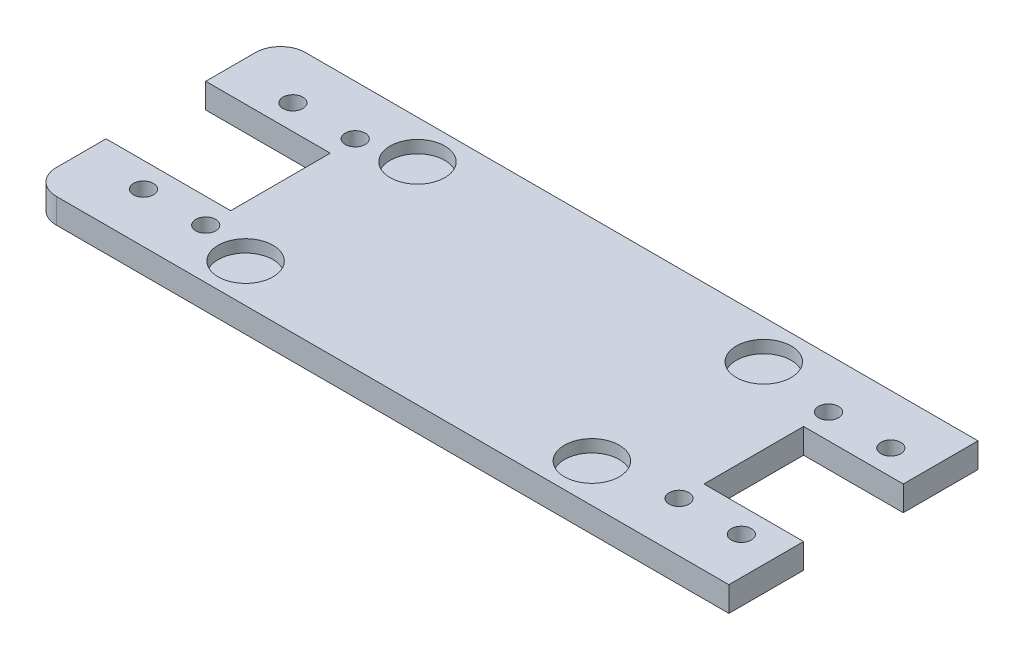
ISO-10303-21;
HEADER;
FILE_DESCRIPTION(('STEP AP214'),'2;1');
FILE_NAME('part.step','',(''),(''),'','','');
FILE_SCHEMA(('AUTOMOTIVE_DESIGN { 1 0 10303 214 1 1 1 1 }'));
ENDSEC;
DATA;
#1=APPLICATION_CONTEXT('core data for automotive mechanical design processes');
#2=APPLICATION_PROTOCOL_DEFINITION('international standard','automotive_design',2000,#1);
#3=PRODUCT_CONTEXT('',#1,'mechanical');
#4=PRODUCT('Part','Part','',(#3));
#5=PRODUCT_RELATED_PRODUCT_CATEGORY('part','',(#4));
#6=PRODUCT_DEFINITION_FORMATION('','',#4);
#7=PRODUCT_DEFINITION_CONTEXT('part definition',#1,'design');
#8=PRODUCT_DEFINITION('design','',#6,#7);
#9=PRODUCT_DEFINITION_SHAPE('','',#8);
#10=(LENGTH_UNIT() NAMED_UNIT(*) SI_UNIT(.MILLI.,.METRE.));
#11=(NAMED_UNIT(*) PLANE_ANGLE_UNIT() SI_UNIT($,.RADIAN.));
#12=(NAMED_UNIT(*) SI_UNIT($,.STERADIAN.) SOLID_ANGLE_UNIT());
#13=UNCERTAINTY_MEASURE_WITH_UNIT(LENGTH_MEASURE(1.E-05),#10,'distance_accuracy_value','');
#14=(GEOMETRIC_REPRESENTATION_CONTEXT(3) GLOBAL_UNCERTAINTY_ASSIGNED_CONTEXT((#13)) GLOBAL_UNIT_ASSIGNED_CONTEXT((#10,
#11,#12)) REPRESENTATION_CONTEXT('',''));
#15=CARTESIAN_POINT('',(0.,0.,0.));
#16=DIRECTION('',(0.,0.,1.));
#17=DIRECTION('',(1.,0.,0.));
#18=AXIS2_PLACEMENT_3D('',#15,#16,#17);
#19=CARTESIAN_POINT('',(0.,10.,0.));
#20=DIRECTION('',(0.,1.,0.));
#21=DIRECTION('',(0.,0.,1.));
#22=AXIS2_PLACEMENT_3D('',#19,#20,#21);
#23=PLANE('',#22);
#24=CARTESIAN_POINT('',(69.5,10.,-34.5));
#25=DIRECTION('',(0.,1.,0.));
#26=DIRECTION('',(0.,0.,1.));
#27=AXIS2_PLACEMENT_3D('',#24,#25,#26);
#28=CIRCLE('',#27,11.);
#29=CARTESIAN_POINT('',(69.5,10.,-23.5));
#30=VERTEX_POINT('',#29);
#31=EDGE_CURVE('E499',#30,#30,#28,.F.);
#32=ORIENTED_EDGE('',*,*,#31,.T.);
#33=EDGE_LOOP('',(#32));
#34=FACE_BOUND('',#33,.T.);
#35=CARTESIAN_POINT('',(-69.5,10.,34.5));
#36=DIRECTION('',(0.,1.,0.));
#37=DIRECTION('',(0.,0.,1.));
#38=AXIS2_PLACEMENT_3D('',#35,#36,#37);
#39=CIRCLE('',#38,11.);
#40=CARTESIAN_POINT('',(-69.5,10.,45.5));
#41=VERTEX_POINT('',#40);
#42=EDGE_CURVE('E475',#41,#41,#39,.F.);
#43=ORIENTED_EDGE('',*,*,#42,.T.);
#44=EDGE_LOOP('',(#43));
#45=FACE_BOUND('',#44,.T.);
#46=DIRECTION('',(1.,0.,0.));
#47=VECTOR('',#46,1.);
#48=CARTESIAN_POINT('',(100.,10.,20.));
#49=LINE('',#48,#47);
#50=CARTESIAN_POINT('',(100.,10.,20.));
#51=VERTEX_POINT('',#50);
#52=CARTESIAN_POINT('',(140.,10.,20.));
#53=VERTEX_POINT('',#52);
#54=EDGE_CURVE('E154',#51,#53,#49,.T.);
#55=ORIENTED_EDGE('',*,*,#54,.F.);
#56=DIRECTION('',(0.,0.,1.));
#57=VECTOR('',#56,1.);
#58=CARTESIAN_POINT('',(100.,10.,-20.));
#59=LINE('',#58,#57);
#60=CARTESIAN_POINT('',(100.,10.,-20.));
#61=VERTEX_POINT('',#60);
#62=EDGE_CURVE('E458',#61,#51,#59,.T.);
#63=ORIENTED_EDGE('',*,*,#62,.F.);
#64=DIRECTION('',(-1.,0.,0.));
#65=VECTOR('',#64,1.);
#66=CARTESIAN_POINT('',(140.,10.,-20.));
#67=LINE('',#66,#65);
#68=CARTESIAN_POINT('',(140.,10.,-20.));
#69=VERTEX_POINT('',#68);
#70=EDGE_CURVE('E464',#69,#61,#67,.T.);
#71=ORIENTED_EDGE('',*,*,#70,.F.);
#72=DIRECTION('',(0.,0.,-1.));
#73=VECTOR('',#72,1.);
#74=CARTESIAN_POINT('',(140.,10.,-50.));
#75=LINE('',#74,#73);
#76=CARTESIAN_POINT('',(140.,10.,-50.));
#77=VERTEX_POINT('',#76);
#78=EDGE_CURVE('E162',#69,#77,#75,.T.);
#79=ORIENTED_EDGE('',*,*,#78,.T.);
#80=DIRECTION('',(-1.,0.,0.));
#81=VECTOR('',#80,1.);
#82=CARTESIAN_POINT('',(-140.,10.,-50.));
#83=LINE('',#82,#81);
#84=CARTESIAN_POINT('',(-130.,10.,-50.));
#85=VERTEX_POINT('',#84);
#86=EDGE_CURVE('E254',#77,#85,#83,.T.);
#87=ORIENTED_EDGE('',*,*,#86,.T.);
#88=CARTESIAN_POINT('',(-130.,10.,-40.));
#89=DIRECTION('',(0.,1.,0.));
#90=DIRECTION('',(0.,0.,1.));
#91=AXIS2_PLACEMENT_3D('',#88,#89,#90);
#92=CIRCLE('',#91,10.);
#93=CARTESIAN_POINT('',(-140.,10.,-40.));
#94=VERTEX_POINT('',#93);
#95=EDGE_CURVE('E11',#85,#94,#92,.T.);
#96=ORIENTED_EDGE('',*,*,#95,.T.);
#97=DIRECTION('',(0.,0.,1.));
#98=VECTOR('',#97,1.);
#99=CARTESIAN_POINT('',(-140.,10.,-50.));
#100=LINE('',#99,#98);
#101=CARTESIAN_POINT('',(-140.,10.,-20.));
#102=VERTEX_POINT('',#101);
#103=EDGE_CURVE('E245',#94,#102,#100,.T.);
#104=ORIENTED_EDGE('',*,*,#103,.T.);
#105=DIRECTION('',(-1.,0.,0.));
#106=VECTOR('',#105,1.);
#107=CARTESIAN_POINT('',(-140.,10.,-20.));
#108=LINE('',#107,#106);
#109=CARTESIAN_POINT('',(-90.,10.,-20.));
#110=VERTEX_POINT('',#109);
#111=EDGE_CURVE('E408',#110,#102,#108,.T.);
#112=ORIENTED_EDGE('',*,*,#111,.F.);
#113=DIRECTION('',(0.,0.,-1.));
#114=VECTOR('',#113,1.);
#115=CARTESIAN_POINT('',(-90.,10.,-20.));
#116=LINE('',#115,#114);
#117=CARTESIAN_POINT('',(-90.,10.,20.));
#118=VERTEX_POINT('',#117);
#119=EDGE_CURVE('E414',#118,#110,#116,.T.);
#120=ORIENTED_EDGE('',*,*,#119,.F.);
#121=DIRECTION('',(1.,0.,0.));
#122=VECTOR('',#121,1.);
#123=CARTESIAN_POINT('',(-90.,10.,20.));
#124=LINE('',#123,#122);
#125=CARTESIAN_POINT('',(-140.,10.,20.));
#126=VERTEX_POINT('',#125);
#127=EDGE_CURVE('E420',#126,#118,#124,.T.);
#128=ORIENTED_EDGE('',*,*,#127,.F.);
#129=CARTESIAN_POINT('',(-140.,10.,40.));
#130=VERTEX_POINT('',#129);
#131=EDGE_CURVE('E249',#126,#130,#100,.T.);
#132=ORIENTED_EDGE('',*,*,#131,.T.);
#133=CARTESIAN_POINT('',(-130.,10.,40.));
#134=DIRECTION('',(0.,1.,0.));
#135=DIRECTION('',(0.,0.,1.));
#136=AXIS2_PLACEMENT_3D('',#133,#134,#135);
#137=CIRCLE('',#136,10.);
#138=CARTESIAN_POINT('',(-130.,10.,50.));
#139=VERTEX_POINT('',#138);
#140=EDGE_CURVE('E211',#130,#139,#137,.T.);
#141=ORIENTED_EDGE('',*,*,#140,.T.);
#142=DIRECTION('',(1.,0.,0.));
#143=VECTOR('',#142,1.);
#144=CARTESIAN_POINT('',(-140.,10.,50.));
#145=LINE('',#144,#143);
#146=CARTESIAN_POINT('',(140.,10.,50.));
#147=VERTEX_POINT('',#146);
#148=EDGE_CURVE('E183',#139,#147,#145,.T.);
#149=ORIENTED_EDGE('',*,*,#148,.T.);
#150=EDGE_CURVE('E258',#147,#53,#75,.T.);
#151=ORIENTED_EDGE('',*,*,#150,.T.);
#152=EDGE_LOOP('',(#55,#63,#71,#79,#87,#96,#104,#112,#120,#128,#132,#141,#149,#151));
#153=FACE_BOUND('',#152,.T.);
#154=CARTESIAN_POINT('',(125.,10.,30.));
#155=DIRECTION('',(0.,-1.,0.));
#156=DIRECTION('',(0.,0.,-1.));
#157=AXIS2_PLACEMENT_3D('',#154,#155,#156);
#158=CIRCLE('',#157,3.99999999999999);
#159=CARTESIAN_POINT('',(125.,10.,26.));
#160=VERTEX_POINT('',#159);
#161=EDGE_CURVE('E351',#160,#160,#158,.T.);
#162=ORIENTED_EDGE('',*,*,#161,.T.);
#163=EDGE_LOOP('',(#162));
#164=FACE_BOUND('',#163,.T.);
#165=CARTESIAN_POINT('',(100.,10.,30.));
#166=DIRECTION('',(0.,-1.,0.));
#167=DIRECTION('',(0.,0.,-1.));
#168=AXIS2_PLACEMENT_3D('',#165,#166,#167);
#169=CIRCLE('',#168,4.00000000000001);
#170=CARTESIAN_POINT('',(100.,10.,26.));
#171=VERTEX_POINT('',#170);
#172=EDGE_CURVE('E363',#171,#171,#169,.T.);
#173=ORIENTED_EDGE('',*,*,#172,.T.);
#174=EDGE_LOOP('',(#173));
#175=FACE_BOUND('',#174,.T.);
#176=CARTESIAN_POINT('',(125.,10.,-30.));
#177=DIRECTION('',(0.,1.,0.));
#178=DIRECTION('',(0.,0.,1.));
#179=AXIS2_PLACEMENT_3D('',#176,#177,#178);
#180=CIRCLE('',#179,3.99999999999999);
#181=CARTESIAN_POINT('',(125.,10.,-26.));
#182=VERTEX_POINT('',#181);
#183=EDGE_CURVE('E327',#182,#182,#180,.T.);
#184=ORIENTED_EDGE('',*,*,#183,.F.);
#185=EDGE_LOOP('',(#184));
#186=FACE_BOUND('',#185,.T.);
#187=CARTESIAN_POINT('',(100.,10.,-30.));
#188=DIRECTION('',(0.,1.,0.));
#189=DIRECTION('',(0.,0.,1.));
#190=AXIS2_PLACEMENT_3D('',#187,#188,#189);
#191=CIRCLE('',#190,4.00000000000001);
#192=CARTESIAN_POINT('',(100.,10.,-26.));
#193=VERTEX_POINT('',#192);
#194=EDGE_CURVE('E339',#193,#193,#191,.T.);
#195=ORIENTED_EDGE('',*,*,#194,.F.);
#196=EDGE_LOOP('',(#195));
#197=FACE_BOUND('',#196,.T.);
#198=CARTESIAN_POINT('',(-115.,10.,-30.));
#199=DIRECTION('',(0.,-1.,0.));
#200=DIRECTION('',(0.,0.,-1.));
#201=AXIS2_PLACEMENT_3D('',#198,#199,#200);
#202=CIRCLE('',#201,4.00000000000001);
#203=CARTESIAN_POINT('',(-115.,10.,-34.));
#204=VERTEX_POINT('',#203);
#205=EDGE_CURVE('E303',#204,#204,#202,.T.);
#206=ORIENTED_EDGE('',*,*,#205,.T.);
#207=EDGE_LOOP('',(#206));
#208=FACE_BOUND('',#207,.T.);
#209=CARTESIAN_POINT('',(-90.,10.,-30.));
#210=DIRECTION('',(0.,-1.,0.));
#211=DIRECTION('',(0.,0.,-1.));
#212=AXIS2_PLACEMENT_3D('',#209,#210,#211);
#213=CIRCLE('',#212,4.00000000000001);
#214=CARTESIAN_POINT('',(-90.,10.,-34.));
#215=VERTEX_POINT('',#214);
#216=EDGE_CURVE('E315',#215,#215,#213,.T.);
#217=ORIENTED_EDGE('',*,*,#216,.T.);
#218=EDGE_LOOP('',(#217));
#219=FACE_BOUND('',#218,.T.);
#220=CARTESIAN_POINT('',(-115.,10.,30.));
#221=DIRECTION('',(0.,1.,0.));
#222=DIRECTION('',(0.,0.,1.));
#223=AXIS2_PLACEMENT_3D('',#220,#221,#222);
#224=CIRCLE('',#223,4.00000000000001);
#225=CARTESIAN_POINT('',(-115.,10.,34.));
#226=VERTEX_POINT('',#225);
#227=EDGE_CURVE('E179',#226,#226,#224,.T.);
#228=ORIENTED_EDGE('',*,*,#227,.F.);
#229=EDGE_LOOP('',(#228));
#230=FACE_BOUND('',#229,.T.);
#231=CARTESIAN_POINT('',(-90.,10.,30.));
#232=DIRECTION('',(0.,1.,0.));
#233=DIRECTION('',(0.,0.,1.));
#234=AXIS2_PLACEMENT_3D('',#231,#232,#233);
#235=CIRCLE('',#234,4.00000000000001);
#236=CARTESIAN_POINT('',(-90.,10.,34.));
#237=VERTEX_POINT('',#236);
#238=EDGE_CURVE('E291',#237,#237,#235,.T.);
#239=ORIENTED_EDGE('',*,*,#238,.F.);
#240=EDGE_LOOP('',(#239));
#241=FACE_BOUND('',#240,.T.);
#242=CARTESIAN_POINT('',(-69.5,10.,-34.5));
#243=DIRECTION('',(0.,1.,0.));
#244=DIRECTION('',(0.,0.,1.));
#245=AXIS2_PLACEMENT_3D('',#242,#243,#244);
#246=CIRCLE('',#245,11.);
#247=CARTESIAN_POINT('',(-69.5,10.,-23.5));
#248=VERTEX_POINT('',#247);
#249=EDGE_CURVE('E487',#248,#248,#246,.T.);
#250=ORIENTED_EDGE('',*,*,#249,.F.);
#251=EDGE_LOOP('',(#250));
#252=FACE_BOUND('',#251,.T.);
#253=CARTESIAN_POINT('',(69.5,10.,34.5));
#254=DIRECTION('',(0.,1.,0.));
#255=DIRECTION('',(0.,0.,1.));
#256=AXIS2_PLACEMENT_3D('',#253,#254,#255);
#257=CIRCLE('',#256,11.);
#258=CARTESIAN_POINT('',(69.5,10.,45.5));
#259=VERTEX_POINT('',#258);
#260=EDGE_CURVE('E511',#259,#259,#257,.T.);
#261=ORIENTED_EDGE('',*,*,#260,.F.);
#262=EDGE_LOOP('',(#261));
#263=FACE_BOUND('',#262,.T.);
#264=ADVANCED_FACE('F43',(#34,#45,#153,#164,#175,#186,#197,#208,#219,#230,#241,#252,#263),#23,.T.);
#265=CARTESIAN_POINT('',(140.,10.,-50.));
#266=DIRECTION('',(-1.,0.,0.));
#267=DIRECTION('',(0.,0.,1.));
#268=AXIS2_PLACEMENT_3D('',#265,#266,#267);
#269=PLANE('',#268);
#270=DIRECTION('',(0.,0.,-1.));
#271=VECTOR('',#270,1.);
#272=CARTESIAN_POINT('',(140.,0.,-50.));
#273=LINE('',#272,#271);
#274=CARTESIAN_POINT('',(140.,0.,50.));
#275=VERTEX_POINT('',#274);
#276=CARTESIAN_POINT('',(140.,0.,20.));
#277=VERTEX_POINT('',#276);
#278=EDGE_CURVE('E170',#275,#277,#273,.T.);
#279=ORIENTED_EDGE('',*,*,#278,.T.);
#280=DIRECTION('',(0.,1.,0.));
#281=VECTOR('',#280,1.);
#282=CARTESIAN_POINT('',(140.,0.,20.));
#283=LINE('',#282,#281);
#284=EDGE_CURVE('E426',#277,#53,#283,.T.);
#285=ORIENTED_EDGE('',*,*,#284,.T.);
#286=ORIENTED_EDGE('',*,*,#150,.F.);
#287=DIRECTION('',(0.,-1.,0.));
#288=VECTOR('',#287,1.);
#289=CARTESIAN_POINT('',(140.,10.,50.));
#290=LINE('',#289,#288);
#291=EDGE_CURVE('E194',#147,#275,#290,.T.);
#292=ORIENTED_EDGE('',*,*,#291,.T.);
#293=EDGE_LOOP('',(#279,#285,#286,#292));
#294=FACE_BOUND('',#293,.T.);
#295=ADVANCED_FACE('F523',(#294),#269,.F.);
#296=CARTESIAN_POINT('',(-140.,10.,-50.));
#297=DIRECTION('',(1.,0.,0.));
#298=DIRECTION('',(0.,0.,-1.));
#299=AXIS2_PLACEMENT_3D('',#296,#297,#298);
#300=PLANE('',#299);
#301=ORIENTED_EDGE('',*,*,#103,.F.);
#302=DIRECTION('',(0.,-1.,0.));
#303=VECTOR('',#302,1.);
#304=CARTESIAN_POINT('',(-140.,10.,-40.));
#305=LINE('',#304,#303);
#306=CARTESIAN_POINT('',(-140.,0.,-40.));
#307=VERTEX_POINT('',#306);
#308=EDGE_CURVE('E214',#94,#307,#305,.T.);
#309=ORIENTED_EDGE('',*,*,#308,.T.);
#310=DIRECTION('',(0.,0.,1.));
#311=VECTOR('',#310,1.);
#312=CARTESIAN_POINT('',(-140.,0.,-50.));
#313=LINE('',#312,#311);
#314=CARTESIAN_POINT('',(-140.,0.,-20.));
#315=VERTEX_POINT('',#314);
#316=EDGE_CURVE('E188',#307,#315,#313,.T.);
#317=ORIENTED_EDGE('',*,*,#316,.T.);
#318=DIRECTION('',(0.,1.,0.));
#319=VECTOR('',#318,1.);
#320=CARTESIAN_POINT('',(-140.,0.,-20.));
#321=LINE('',#320,#319);
#322=EDGE_CURVE('E369',#315,#102,#321,.T.);
#323=ORIENTED_EDGE('',*,*,#322,.T.);
#324=EDGE_LOOP('',(#301,#309,#317,#323));
#325=FACE_BOUND('',#324,.T.);
#326=ADVANCED_FACE('F529',(#325),#300,.F.);
#327=ORIENTED_EDGE('',*,*,#78,.F.);
#328=DIRECTION('',(0.,1.,0.));
#329=VECTOR('',#328,1.);
#330=CARTESIAN_POINT('',(140.,0.,-20.));
#331=LINE('',#330,#329);
#332=CARTESIAN_POINT('',(140.,0.,-20.));
#333=VERTEX_POINT('',#332);
#334=EDGE_CURVE('E148',#333,#69,#331,.T.);
#335=ORIENTED_EDGE('',*,*,#334,.F.);
#336=CARTESIAN_POINT('',(140.,0.,-50.));
#337=VERTEX_POINT('',#336);
#338=EDGE_CURVE('E160',#333,#337,#273,.T.);
#339=ORIENTED_EDGE('',*,*,#338,.T.);
#340=DIRECTION('',(0.,-1.,0.));
#341=VECTOR('',#340,1.);
#342=CARTESIAN_POINT('',(140.,10.,-50.));
#343=LINE('',#342,#341);
#344=EDGE_CURVE('E198',#77,#337,#343,.T.);
#345=ORIENTED_EDGE('',*,*,#344,.F.);
#346=EDGE_LOOP('',(#327,#335,#339,#345));
#347=FACE_BOUND('',#346,.T.);
#348=ADVANCED_FACE('F158',(#347),#269,.F.);
#349=CARTESIAN_POINT('',(-140.,10.,-50.));
#350=DIRECTION('',(0.,0.,1.));
#351=DIRECTION('',(1.,0.,0.));
#352=AXIS2_PLACEMENT_3D('',#349,#350,#351);
#353=PLANE('',#352);
#354=DIRECTION('',(-1.,0.,0.));
#355=VECTOR('',#354,1.);
#356=CARTESIAN_POINT('',(-140.,0.,-50.));
#357=LINE('',#356,#355);
#358=CARTESIAN_POINT('',(-130.,0.,-50.));
#359=VERTEX_POINT('',#358);
#360=EDGE_CURVE('E167',#337,#359,#357,.T.);
#361=ORIENTED_EDGE('',*,*,#360,.T.);
#362=DIRECTION('',(0.,-1.,0.));
#363=VECTOR('',#362,1.);
#364=CARTESIAN_POINT('',(-130.,10.,-50.));
#365=LINE('',#364,#363);
#366=EDGE_CURVE('E52',#359,#85,#365,.F.);
#367=ORIENTED_EDGE('',*,*,#366,.T.);
#368=ORIENTED_EDGE('',*,*,#86,.F.);
#369=ORIENTED_EDGE('',*,*,#344,.T.);
#370=EDGE_LOOP('',(#361,#367,#368,#369));
#371=FACE_BOUND('',#370,.T.);
#372=ADVANCED_FACE('F547',(#371),#353,.F.);
#373=CARTESIAN_POINT('',(-140.,0.,20.));
#374=VERTEX_POINT('',#373);
#375=CARTESIAN_POINT('',(-140.,0.,40.));
#376=VERTEX_POINT('',#375);
#377=EDGE_CURVE('E187',#374,#376,#313,.T.);
#378=ORIENTED_EDGE('',*,*,#377,.T.);
#379=DIRECTION('',(0.,-1.,0.));
#380=VECTOR('',#379,1.);
#381=CARTESIAN_POINT('',(-140.,10.,40.));
#382=LINE('',#381,#380);
#383=EDGE_CURVE('E208',#376,#130,#382,.F.);
#384=ORIENTED_EDGE('',*,*,#383,.T.);
#385=ORIENTED_EDGE('',*,*,#131,.F.);
#386=DIRECTION('',(0.,1.,0.));
#387=VECTOR('',#386,1.);
#388=CARTESIAN_POINT('',(-140.,0.,20.));
#389=LINE('',#388,#387);
#390=EDGE_CURVE('E385',#374,#126,#389,.T.);
#391=ORIENTED_EDGE('',*,*,#390,.F.);
#392=EDGE_LOOP('',(#378,#384,#385,#391));
#393=FACE_BOUND('',#392,.T.);
#394=ADVANCED_FACE('F543',(#393),#300,.F.);
#395=CARTESIAN_POINT('',(-140.,10.,50.));
#396=DIRECTION('',(0.,0.,-1.));
#397=DIRECTION('',(-1.,0.,0.));
#398=AXIS2_PLACEMENT_3D('',#395,#396,#397);
#399=PLANE('',#398);
#400=ORIENTED_EDGE('',*,*,#148,.F.);
#401=DIRECTION('',(0.,-1.,0.));
#402=VECTOR('',#401,1.);
#403=CARTESIAN_POINT('',(-130.,10.,50.));
#404=LINE('',#403,#402);
#405=CARTESIAN_POINT('',(-130.,0.,50.));
#406=VERTEX_POINT('',#405);
#407=EDGE_CURVE('E201',#139,#406,#404,.T.);
#408=ORIENTED_EDGE('',*,*,#407,.T.);
#409=DIRECTION('',(1.,0.,0.));
#410=VECTOR('',#409,1.);
#411=CARTESIAN_POINT('',(-140.,0.,50.));
#412=LINE('',#411,#410);
#413=EDGE_CURVE('E191',#406,#275,#412,.T.);
#414=ORIENTED_EDGE('',*,*,#413,.T.);
#415=ORIENTED_EDGE('',*,*,#291,.F.);
#416=EDGE_LOOP('',(#400,#408,#414,#415));
#417=FACE_BOUND('',#416,.T.);
#418=ADVANCED_FACE('F539',(#417),#399,.F.);
#419=CARTESIAN_POINT('',(0.,0.,0.));
#420=DIRECTION('',(0.,1.,0.));
#421=DIRECTION('',(0.,0.,1.));
#422=AXIS2_PLACEMENT_3D('',#419,#420,#421);
#423=PLANE('',#422);
#424=CARTESIAN_POINT('',(125.,0.,30.));
#425=DIRECTION('',(0.,-1.,0.));
#426=DIRECTION('',(0.,0.,-1.));
#427=AXIS2_PLACEMENT_3D('',#424,#425,#426);
#428=CIRCLE('',#427,3.99999999999999);
#429=CARTESIAN_POINT('',(125.,0.,26.));
#430=VERTEX_POINT('',#429);
#431=EDGE_CURVE('E345',#430,#430,#428,.T.);
#432=ORIENTED_EDGE('',*,*,#431,.F.);
#433=EDGE_LOOP('',(#432));
#434=FACE_BOUND('',#433,.T.);
#435=CARTESIAN_POINT('',(100.,0.,30.));
#436=DIRECTION('',(0.,-1.,0.));
#437=DIRECTION('',(0.,0.,-1.));
#438=AXIS2_PLACEMENT_3D('',#435,#436,#437);
#439=CIRCLE('',#438,4.00000000000001);
#440=CARTESIAN_POINT('',(100.,0.,26.));
#441=VERTEX_POINT('',#440);
#442=EDGE_CURVE('E357',#441,#441,#439,.T.);
#443=ORIENTED_EDGE('',*,*,#442,.F.);
#444=EDGE_LOOP('',(#443));
#445=FACE_BOUND('',#444,.T.);
#446=CARTESIAN_POINT('',(125.,0.,-30.));
#447=DIRECTION('',(0.,1.,0.));
#448=DIRECTION('',(0.,0.,1.));
#449=AXIS2_PLACEMENT_3D('',#446,#447,#448);
#450=CIRCLE('',#449,3.99999999999999);
#451=CARTESIAN_POINT('',(125.,0.,-26.));
#452=VERTEX_POINT('',#451);
#453=EDGE_CURVE('E321',#452,#452,#450,.T.);
#454=ORIENTED_EDGE('',*,*,#453,.T.);
#455=EDGE_LOOP('',(#454));
#456=FACE_BOUND('',#455,.T.);
#457=CARTESIAN_POINT('',(100.,0.,-30.));
#458=DIRECTION('',(0.,1.,0.));
#459=DIRECTION('',(0.,0.,1.));
#460=AXIS2_PLACEMENT_3D('',#457,#458,#459);
#461=CIRCLE('',#460,4.00000000000001);
#462=CARTESIAN_POINT('',(100.,0.,-26.));
#463=VERTEX_POINT('',#462);
#464=EDGE_CURVE('E333',#463,#463,#461,.T.);
#465=ORIENTED_EDGE('',*,*,#464,.T.);
#466=EDGE_LOOP('',(#465));
#467=FACE_BOUND('',#466,.T.);
#468=CARTESIAN_POINT('',(-115.,0.,-30.));
#469=DIRECTION('',(0.,-1.,0.));
#470=DIRECTION('',(0.,0.,-1.));
#471=AXIS2_PLACEMENT_3D('',#468,#469,#470);
#472=CIRCLE('',#471,4.00000000000001);
#473=CARTESIAN_POINT('',(-115.,0.,-34.));
#474=VERTEX_POINT('',#473);
#475=EDGE_CURVE('E297',#474,#474,#472,.T.);
#476=ORIENTED_EDGE('',*,*,#475,.F.);
#477=EDGE_LOOP('',(#476));
#478=FACE_BOUND('',#477,.T.);
#479=CARTESIAN_POINT('',(-90.,0.,-30.));
#480=DIRECTION('',(0.,-1.,0.));
#481=DIRECTION('',(0.,0.,-1.));
#482=AXIS2_PLACEMENT_3D('',#479,#480,#481);
#483=CIRCLE('',#482,4.00000000000001);
#484=CARTESIAN_POINT('',(-90.,0.,-34.));
#485=VERTEX_POINT('',#484);
#486=EDGE_CURVE('E309',#485,#485,#483,.T.);
#487=ORIENTED_EDGE('',*,*,#486,.F.);
#488=EDGE_LOOP('',(#487));
#489=FACE_BOUND('',#488,.T.);
#490=CARTESIAN_POINT('',(-115.,0.,30.));
#491=DIRECTION('',(0.,1.,0.));
#492=DIRECTION('',(0.,0.,1.));
#493=AXIS2_PLACEMENT_3D('',#490,#491,#492);
#494=CIRCLE('',#493,4.00000000000001);
#495=CARTESIAN_POINT('',(-115.,0.,34.));
#496=VERTEX_POINT('',#495);
#497=EDGE_CURVE('E171',#496,#496,#494,.T.);
#498=ORIENTED_EDGE('',*,*,#497,.T.);
#499=EDGE_LOOP('',(#498));
#500=FACE_BOUND('',#499,.T.);
#501=CARTESIAN_POINT('',(-90.,0.,30.));
#502=DIRECTION('',(0.,1.,0.));
#503=DIRECTION('',(0.,0.,1.));
#504=AXIS2_PLACEMENT_3D('',#501,#502,#503);
#505=CIRCLE('',#504,4.00000000000001);
#506=CARTESIAN_POINT('',(-90.,0.,34.));
#507=VERTEX_POINT('',#506);
#508=EDGE_CURVE('E285',#507,#507,#505,.T.);
#509=ORIENTED_EDGE('',*,*,#508,.T.);
#510=EDGE_LOOP('',(#509));
#511=FACE_BOUND('',#510,.T.);
#512=DIRECTION('',(0.,0.,1.));
#513=VECTOR('',#512,1.);
#514=CARTESIAN_POINT('',(100.,0.,-20.));
#515=LINE('',#514,#513);
#516=CARTESIAN_POINT('',(100.,0.,-20.));
#517=VERTEX_POINT('',#516);
#518=CARTESIAN_POINT('',(100.,0.,20.));
#519=VERTEX_POINT('',#518);
#520=EDGE_CURVE('E59',#517,#519,#515,.T.);
#521=ORIENTED_EDGE('',*,*,#520,.T.);
#522=DIRECTION('',(1.,0.,0.));
#523=VECTOR('',#522,1.);
#524=CARTESIAN_POINT('',(100.,0.,20.));
#525=LINE('',#524,#523);
#526=EDGE_CURVE('E164',#519,#277,#525,.T.);
#527=ORIENTED_EDGE('',*,*,#526,.T.);
#528=ORIENTED_EDGE('',*,*,#278,.F.);
#529=ORIENTED_EDGE('',*,*,#413,.F.);
#530=CARTESIAN_POINT('',(-130.,0.,40.));
#531=DIRECTION('',(0.,1.,0.));
#532=DIRECTION('',(0.,0.,1.));
#533=AXIS2_PLACEMENT_3D('',#530,#531,#532);
#534=CIRCLE('',#533,10.);
#535=EDGE_CURVE('E205',#406,#376,#534,.F.);
#536=ORIENTED_EDGE('',*,*,#535,.T.);
#537=ORIENTED_EDGE('',*,*,#377,.F.);
#538=DIRECTION('',(1.,0.,0.));
#539=VECTOR('',#538,1.);
#540=CARTESIAN_POINT('',(-90.,0.,20.));
#541=LINE('',#540,#539);
#542=CARTESIAN_POINT('',(-90.,0.,20.));
#543=VERTEX_POINT('',#542);
#544=EDGE_CURVE('E402',#374,#543,#541,.T.);
#545=ORIENTED_EDGE('',*,*,#544,.T.);
#546=DIRECTION('',(0.,0.,-1.));
#547=VECTOR('',#546,1.);
#548=CARTESIAN_POINT('',(-90.,0.,-20.));
#549=LINE('',#548,#547);
#550=CARTESIAN_POINT('',(-90.,0.,-20.));
#551=VERTEX_POINT('',#550);
#552=EDGE_CURVE('E396',#543,#551,#549,.T.);
#553=ORIENTED_EDGE('',*,*,#552,.T.);
#554=DIRECTION('',(-1.,0.,0.));
#555=VECTOR('',#554,1.);
#556=CARTESIAN_POINT('',(-140.,0.,-20.));
#557=LINE('',#556,#555);
#558=EDGE_CURVE('E390',#551,#315,#557,.T.);
#559=ORIENTED_EDGE('',*,*,#558,.T.);
#560=ORIENTED_EDGE('',*,*,#316,.F.);
#561=CARTESIAN_POINT('',(-130.,0.,-40.));
#562=DIRECTION('',(0.,1.,0.));
#563=DIRECTION('',(0.,0.,1.));
#564=AXIS2_PLACEMENT_3D('',#561,#562,#563);
#565=CIRCLE('',#564,10.);
#566=EDGE_CURVE('E218',#307,#359,#565,.F.);
#567=ORIENTED_EDGE('',*,*,#566,.T.);
#568=ORIENTED_EDGE('',*,*,#360,.F.);
#569=ORIENTED_EDGE('',*,*,#338,.F.);
#570=DIRECTION('',(-1.,0.,0.));
#571=VECTOR('',#570,1.);
#572=CARTESIAN_POINT('',(140.,0.,-20.));
#573=LINE('',#572,#571);
#574=EDGE_CURVE('E144',#333,#517,#573,.T.);
#575=ORIENTED_EDGE('',*,*,#574,.T.);
#576=EDGE_LOOP('',(#521,#527,#528,#529,#536,#537,#545,#553,#559,#560,#567,#568,#569,#575));
#577=FACE_BOUND('',#576,.T.);
#578=ADVANCED_FACE('F166',(#434,#445,#456,#467,#478,#489,#500,#511,#577),#423,.F.);
#579=CARTESIAN_POINT('',(-90.,0.,30.));
#580=DIRECTION('',(0.,1.,0.));
#581=DIRECTION('',(0.,0.,1.));
#582=AXIS2_PLACEMENT_3D('',#579,#580,#581);
#583=CYLINDRICAL_SURFACE('',#582,4.00000000000001);
#584=ORIENTED_EDGE('',*,*,#508,.F.);
#585=EDGE_LOOP('',(#584));
#586=FACE_BOUND('',#585,.T.);
#587=ORIENTED_EDGE('',*,*,#238,.T.);
#588=EDGE_LOOP('',(#587));
#589=FACE_BOUND('',#588,.T.);
#590=ADVANCED_FACE('F535',(#586,#589),#583,.F.);
#591=CARTESIAN_POINT('',(-115.,0.,30.));
#592=DIRECTION('',(0.,1.,0.));
#593=DIRECTION('',(0.,0.,1.));
#594=AXIS2_PLACEMENT_3D('',#591,#592,#593);
#595=CYLINDRICAL_SURFACE('',#594,4.00000000000001);
#596=ORIENTED_EDGE('',*,*,#497,.F.);
#597=EDGE_LOOP('',(#596));
#598=FACE_BOUND('',#597,.T.);
#599=ORIENTED_EDGE('',*,*,#227,.T.);
#600=EDGE_LOOP('',(#599));
#601=FACE_BOUND('',#600,.T.);
#602=ADVANCED_FACE('F626',(#598,#601),#595,.F.);
#603=CARTESIAN_POINT('',(-90.,0.,-30.));
#604=DIRECTION('',(0.,1.,0.));
#605=DIRECTION('',(0.,0.,1.));
#606=AXIS2_PLACEMENT_3D('',#603,#604,#605);
#607=CYLINDRICAL_SURFACE('',#606,4.00000000000001);
#608=ORIENTED_EDGE('',*,*,#486,.T.);
#609=EDGE_LOOP('',(#608));
#610=FACE_BOUND('',#609,.T.);
#611=ORIENTED_EDGE('',*,*,#216,.F.);
#612=EDGE_LOOP('',(#611));
#613=FACE_BOUND('',#612,.T.);
#614=ADVANCED_FACE('F623',(#610,#613),#607,.F.);
#615=CARTESIAN_POINT('',(-115.,0.,-30.));
#616=DIRECTION('',(0.,1.,0.));
#617=DIRECTION('',(0.,0.,1.));
#618=AXIS2_PLACEMENT_3D('',#615,#616,#617);
#619=CYLINDRICAL_SURFACE('',#618,4.00000000000001);
#620=ORIENTED_EDGE('',*,*,#475,.T.);
#621=EDGE_LOOP('',(#620));
#622=FACE_BOUND('',#621,.T.);
#623=ORIENTED_EDGE('',*,*,#205,.F.);
#624=EDGE_LOOP('',(#623));
#625=FACE_BOUND('',#624,.T.);
#626=ADVANCED_FACE('F619',(#622,#625),#619,.F.);
#627=CARTESIAN_POINT('',(100.,0.,-30.));
#628=DIRECTION('',(0.,1.,0.));
#629=DIRECTION('',(0.,0.,1.));
#630=AXIS2_PLACEMENT_3D('',#627,#628,#629);
#631=CYLINDRICAL_SURFACE('',#630,4.00000000000001);
#632=ORIENTED_EDGE('',*,*,#464,.F.);
#633=EDGE_LOOP('',(#632));
#634=FACE_BOUND('',#633,.T.);
#635=ORIENTED_EDGE('',*,*,#194,.T.);
#636=EDGE_LOOP('',(#635));
#637=FACE_BOUND('',#636,.T.);
#638=ADVANCED_FACE('F615',(#634,#637),#631,.F.);
#639=CARTESIAN_POINT('',(125.,0.,-30.));
#640=DIRECTION('',(0.,1.,0.));
#641=DIRECTION('',(0.,0.,1.));
#642=AXIS2_PLACEMENT_3D('',#639,#640,#641);
#643=CYLINDRICAL_SURFACE('',#642,3.99999999999999);
#644=ORIENTED_EDGE('',*,*,#453,.F.);
#645=EDGE_LOOP('',(#644));
#646=FACE_BOUND('',#645,.T.);
#647=ORIENTED_EDGE('',*,*,#183,.T.);
#648=EDGE_LOOP('',(#647));
#649=FACE_BOUND('',#648,.T.);
#650=ADVANCED_FACE('F611',(#646,#649),#643,.F.);
#651=CARTESIAN_POINT('',(100.,0.,30.));
#652=DIRECTION('',(0.,1.,0.));
#653=DIRECTION('',(0.,0.,1.));
#654=AXIS2_PLACEMENT_3D('',#651,#652,#653);
#655=CYLINDRICAL_SURFACE('',#654,4.00000000000001);
#656=ORIENTED_EDGE('',*,*,#442,.T.);
#657=EDGE_LOOP('',(#656));
#658=FACE_BOUND('',#657,.T.);
#659=ORIENTED_EDGE('',*,*,#172,.F.);
#660=EDGE_LOOP('',(#659));
#661=FACE_BOUND('',#660,.T.);
#662=ADVANCED_FACE('F607',(#658,#661),#655,.F.);
#663=CARTESIAN_POINT('',(125.,0.,30.));
#664=DIRECTION('',(0.,1.,0.));
#665=DIRECTION('',(0.,0.,1.));
#666=AXIS2_PLACEMENT_3D('',#663,#664,#665);
#667=CYLINDRICAL_SURFACE('',#666,3.99999999999999);
#668=ORIENTED_EDGE('',*,*,#431,.T.);
#669=EDGE_LOOP('',(#668));
#670=FACE_BOUND('',#669,.T.);
#671=ORIENTED_EDGE('',*,*,#161,.F.);
#672=EDGE_LOOP('',(#671));
#673=FACE_BOUND('',#672,.T.);
#674=ADVANCED_FACE('F601',(#670,#673),#667,.F.);
#675=CARTESIAN_POINT('',(-140.,0.,-20.));
#676=DIRECTION('',(0.,0.,-1.));
#677=DIRECTION('',(-1.,0.,0.));
#678=AXIS2_PLACEMENT_3D('',#675,#676,#677);
#679=PLANE('',#678);
#680=ORIENTED_EDGE('',*,*,#111,.T.);
#681=ORIENTED_EDGE('',*,*,#322,.F.);
#682=ORIENTED_EDGE('',*,*,#558,.F.);
#683=DIRECTION('',(0.,1.,0.));
#684=VECTOR('',#683,1.);
#685=CARTESIAN_POINT('',(-90.,0.,-20.));
#686=LINE('',#685,#684);
#687=EDGE_CURVE('E375',#551,#110,#686,.T.);
#688=ORIENTED_EDGE('',*,*,#687,.T.);
#689=EDGE_LOOP('',(#680,#681,#682,#688));
#690=FACE_BOUND('',#689,.T.);
#691=ADVANCED_FACE('F590',(#690),#679,.F.);
#692=CARTESIAN_POINT('',(-90.,0.,-20.));
#693=DIRECTION('',(1.,0.,0.));
#694=DIRECTION('',(0.,0.,-1.));
#695=AXIS2_PLACEMENT_3D('',#692,#693,#694);
#696=PLANE('',#695);
#697=ORIENTED_EDGE('',*,*,#119,.T.);
#698=ORIENTED_EDGE('',*,*,#687,.F.);
#699=ORIENTED_EDGE('',*,*,#552,.F.);
#700=DIRECTION('',(0.,1.,0.));
#701=VECTOR('',#700,1.);
#702=CARTESIAN_POINT('',(-90.,0.,20.));
#703=LINE('',#702,#701);
#704=EDGE_CURVE('E380',#543,#118,#703,.T.);
#705=ORIENTED_EDGE('',*,*,#704,.T.);
#706=EDGE_LOOP('',(#697,#698,#699,#705));
#707=FACE_BOUND('',#706,.T.);
#708=ADVANCED_FACE('F561',(#707),#696,.F.);
#709=CARTESIAN_POINT('',(-90.,0.,20.));
#710=DIRECTION('',(0.,0.,1.));
#711=DIRECTION('',(1.,0.,0.));
#712=AXIS2_PLACEMENT_3D('',#709,#710,#711);
#713=PLANE('',#712);
#714=ORIENTED_EDGE('',*,*,#127,.T.);
#715=ORIENTED_EDGE('',*,*,#704,.F.);
#716=ORIENTED_EDGE('',*,*,#544,.F.);
#717=ORIENTED_EDGE('',*,*,#390,.T.);
#718=EDGE_LOOP('',(#714,#715,#716,#717));
#719=FACE_BOUND('',#718,.T.);
#720=ADVANCED_FACE('F553',(#719),#713,.F.);
#721=CARTESIAN_POINT('',(-130.,10.,40.));
#722=DIRECTION('',(0.,-1.,0.));
#723=DIRECTION('',(0.,0.,-1.));
#724=AXIS2_PLACEMENT_3D('',#721,#722,#723);
#725=CYLINDRICAL_SURFACE('',#724,10.);
#726=ORIENTED_EDGE('',*,*,#140,.F.);
#727=ORIENTED_EDGE('',*,*,#383,.F.);
#728=ORIENTED_EDGE('',*,*,#535,.F.);
#729=ORIENTED_EDGE('',*,*,#407,.F.);
#730=EDGE_LOOP('',(#726,#727,#728,#729));
#731=FACE_BOUND('',#730,.T.);
#732=ADVANCED_FACE('F551',(#731),#725,.T.);
#733=CARTESIAN_POINT('',(-130.,10.,-40.));
#734=DIRECTION('',(0.,-1.,0.));
#735=DIRECTION('',(0.,0.,-1.));
#736=AXIS2_PLACEMENT_3D('',#733,#734,#735);
#737=CYLINDRICAL_SURFACE('',#736,10.);
#738=ORIENTED_EDGE('',*,*,#95,.F.);
#739=ORIENTED_EDGE('',*,*,#366,.F.);
#740=ORIENTED_EDGE('',*,*,#566,.F.);
#741=ORIENTED_EDGE('',*,*,#308,.F.);
#742=EDGE_LOOP('',(#738,#739,#740,#741));
#743=FACE_BOUND('',#742,.T.);
#744=ADVANCED_FACE('F45',(#743),#737,.T.);
#745=CARTESIAN_POINT('',(100.,0.,20.));
#746=DIRECTION('',(0.,0.,1.));
#747=DIRECTION('',(1.,0.,0.));
#748=AXIS2_PLACEMENT_3D('',#745,#746,#747);
#749=PLANE('',#748);
#750=ORIENTED_EDGE('',*,*,#54,.T.);
#751=ORIENTED_EDGE('',*,*,#284,.F.);
#752=ORIENTED_EDGE('',*,*,#526,.F.);
#753=DIRECTION('',(0.,1.,0.));
#754=VECTOR('',#753,1.);
#755=CARTESIAN_POINT('',(100.,0.,20.));
#756=LINE('',#755,#754);
#757=EDGE_CURVE('E432',#519,#51,#756,.T.);
#758=ORIENTED_EDGE('',*,*,#757,.T.);
#759=EDGE_LOOP('',(#750,#751,#752,#758));
#760=FACE_BOUND('',#759,.T.);
#761=ADVANCED_FACE('F559',(#760),#749,.F.);
#762=CARTESIAN_POINT('',(100.,0.,-20.));
#763=DIRECTION('',(-1.,0.,0.));
#764=DIRECTION('',(0.,0.,1.));
#765=AXIS2_PLACEMENT_3D('',#762,#763,#764);
#766=PLANE('',#765);
#767=ORIENTED_EDGE('',*,*,#62,.T.);
#768=ORIENTED_EDGE('',*,*,#757,.F.);
#769=ORIENTED_EDGE('',*,*,#520,.F.);
#770=DIRECTION('',(0.,1.,0.));
#771=VECTOR('',#770,1.);
#772=CARTESIAN_POINT('',(100.,0.,-20.));
#773=LINE('',#772,#771);
#774=EDGE_CURVE('E150',#517,#61,#773,.T.);
#775=ORIENTED_EDGE('',*,*,#774,.T.);
#776=EDGE_LOOP('',(#767,#768,#769,#775));
#777=FACE_BOUND('',#776,.T.);
#778=ADVANCED_FACE('F580',(#777),#766,.F.);
#779=CARTESIAN_POINT('',(140.,0.,-20.));
#780=DIRECTION('',(0.,0.,-1.));
#781=DIRECTION('',(-1.,0.,0.));
#782=AXIS2_PLACEMENT_3D('',#779,#780,#781);
#783=PLANE('',#782);
#784=ORIENTED_EDGE('',*,*,#70,.T.);
#785=ORIENTED_EDGE('',*,*,#774,.F.);
#786=ORIENTED_EDGE('',*,*,#574,.F.);
#787=ORIENTED_EDGE('',*,*,#334,.T.);
#788=EDGE_LOOP('',(#784,#785,#786,#787));
#789=FACE_BOUND('',#788,.T.);
#790=ADVANCED_FACE('F147',(#789),#783,.F.);
#791=CARTESIAN_POINT('',(-69.5,5.,34.5));
#792=DIRECTION('',(0.,1.,0.));
#793=DIRECTION('',(0.,0.,1.));
#794=AXIS2_PLACEMENT_3D('',#791,#792,#793);
#795=CYLINDRICAL_SURFACE('',#794,11.);
#796=CARTESIAN_POINT('',(-69.5,5.,34.5));
#797=DIRECTION('',(0.,1.,0.));
#798=DIRECTION('',(0.,0.,1.));
#799=AXIS2_PLACEMENT_3D('',#796,#797,#798);
#800=CIRCLE('',#799,11.);
#801=CARTESIAN_POINT('',(-69.5,5.,45.5));
#802=VERTEX_POINT('',#801);
#803=EDGE_CURVE('E469',#802,#802,#800,.F.);
#804=ORIENTED_EDGE('',*,*,#803,.T.);
#805=EDGE_LOOP('',(#804));
#806=FACE_BOUND('',#805,.T.);
#807=ORIENTED_EDGE('',*,*,#42,.F.);
#808=EDGE_LOOP('',(#807));
#809=FACE_BOUND('',#808,.T.);
#810=ADVANCED_FACE('F656',(#806,#809),#795,.F.);
#811=CARTESIAN_POINT('',(0.,5.,0.));
#812=DIRECTION('',(0.,1.,0.));
#813=DIRECTION('',(0.,0.,1.));
#814=AXIS2_PLACEMENT_3D('',#811,#812,#813);
#815=PLANE('',#814);
#816=ORIENTED_EDGE('',*,*,#803,.F.);
#817=EDGE_LOOP('',(#816));
#818=FACE_BOUND('',#817,.T.);
#819=ADVANCED_FACE('F646',(#818),#815,.T.);
#820=CARTESIAN_POINT('',(-69.5,5.,-34.5));
#821=DIRECTION('',(0.,1.,0.));
#822=DIRECTION('',(0.,0.,1.));
#823=AXIS2_PLACEMENT_3D('',#820,#821,#822);
#824=CYLINDRICAL_SURFACE('',#823,11.);
#825=CARTESIAN_POINT('',(-69.5,5.,-34.5));
#826=DIRECTION('',(0.,1.,0.));
#827=DIRECTION('',(0.,0.,1.));
#828=AXIS2_PLACEMENT_3D('',#825,#826,#827);
#829=CIRCLE('',#828,11.);
#830=CARTESIAN_POINT('',(-69.5,5.,-23.5));
#831=VERTEX_POINT('',#830);
#832=EDGE_CURVE('E481',#831,#831,#829,.T.);
#833=ORIENTED_EDGE('',*,*,#832,.F.);
#834=EDGE_LOOP('',(#833));
#835=FACE_BOUND('',#834,.T.);
#836=ORIENTED_EDGE('',*,*,#249,.T.);
#837=EDGE_LOOP('',(#836));
#838=FACE_BOUND('',#837,.T.);
#839=ADVANCED_FACE('F643',(#835,#838),#824,.F.);
#840=CARTESIAN_POINT('',(0.,5.,0.));
#841=DIRECTION('',(0.,1.,0.));
#842=DIRECTION('',(0.,0.,1.));
#843=AXIS2_PLACEMENT_3D('',#840,#841,#842);
#844=PLANE('',#843);
#845=ORIENTED_EDGE('',*,*,#832,.T.);
#846=EDGE_LOOP('',(#845));
#847=FACE_BOUND('',#846,.T.);
#848=ADVANCED_FACE('F645',(#847),#844,.T.);
#849=CARTESIAN_POINT('',(69.5,5.,-34.5));
#850=DIRECTION('',(0.,1.,0.));
#851=DIRECTION('',(0.,0.,1.));
#852=AXIS2_PLACEMENT_3D('',#849,#850,#851);
#853=CYLINDRICAL_SURFACE('',#852,11.);
#854=CARTESIAN_POINT('',(69.5,5.,-34.5));
#855=DIRECTION('',(0.,1.,0.));
#856=DIRECTION('',(0.,0.,1.));
#857=AXIS2_PLACEMENT_3D('',#854,#855,#856);
#858=CIRCLE('',#857,11.);
#859=CARTESIAN_POINT('',(69.5,5.,-23.5));
#860=VERTEX_POINT('',#859);
#861=EDGE_CURVE('E493',#860,#860,#858,.F.);
#862=ORIENTED_EDGE('',*,*,#861,.T.);
#863=EDGE_LOOP('',(#862));
#864=FACE_BOUND('',#863,.T.);
#865=ORIENTED_EDGE('',*,*,#31,.F.);
#866=EDGE_LOOP('',(#865));
#867=FACE_BOUND('',#866,.T.);
#868=ADVANCED_FACE('F653',(#864,#867),#853,.F.);
#869=CARTESIAN_POINT('',(0.,5.,0.));
#870=DIRECTION('',(0.,1.,0.));
#871=DIRECTION('',(0.,0.,1.));
#872=AXIS2_PLACEMENT_3D('',#869,#870,#871);
#873=PLANE('',#872);
#874=ORIENTED_EDGE('',*,*,#861,.F.);
#875=EDGE_LOOP('',(#874));
#876=FACE_BOUND('',#875,.T.);
#877=ADVANCED_FACE('F661',(#876),#873,.T.);
#878=CARTESIAN_POINT('',(69.5,5.,34.5));
#879=DIRECTION('',(0.,1.,0.));
#880=DIRECTION('',(0.,0.,1.));
#881=AXIS2_PLACEMENT_3D('',#878,#879,#880);
#882=CYLINDRICAL_SURFACE('',#881,11.);
#883=CARTESIAN_POINT('',(69.5,5.,34.5));
#884=DIRECTION('',(0.,1.,0.));
#885=DIRECTION('',(0.,0.,1.));
#886=AXIS2_PLACEMENT_3D('',#883,#884,#885);
#887=CIRCLE('',#886,11.);
#888=CARTESIAN_POINT('',(69.5,5.,45.5));
#889=VERTEX_POINT('',#888);
#890=EDGE_CURVE('E505',#889,#889,#887,.T.);
#891=ORIENTED_EDGE('',*,*,#890,.F.);
#892=EDGE_LOOP('',(#891));
#893=FACE_BOUND('',#892,.T.);
#894=ORIENTED_EDGE('',*,*,#260,.T.);
#895=EDGE_LOOP('',(#894));
#896=FACE_BOUND('',#895,.T.);
#897=ADVANCED_FACE('F520',(#893,#896),#882,.F.);
#898=CARTESIAN_POINT('',(0.,5.,0.));
#899=DIRECTION('',(0.,1.,0.));
#900=DIRECTION('',(0.,0.,1.));
#901=AXIS2_PLACEMENT_3D('',#898,#899,#900);
#902=PLANE('',#901);
#903=ORIENTED_EDGE('',*,*,#890,.T.);
#904=EDGE_LOOP('',(#903));
#905=FACE_BOUND('',#904,.T.);
#906=ADVANCED_FACE('F668',(#905),#902,.T.);
#907=CLOSED_SHELL('',(#264,#295,#326,#348,#372,#394,#418,#578,#590,#602,#614,#626,#638,#650,
#662,#674,#691,#708,#720,#732,#744,#761,#778,#790,#810,#819,#839,#848,#868,#877,#897,#906));
#908=MANIFOLD_SOLID_BREP('B2',#907);
#909=ADVANCED_BREP_SHAPE_REPRESENTATION('',(#18,#908),#14);
#910=SHAPE_DEFINITION_REPRESENTATION(#9,#909);
ENDSEC;
END-ISO-10303-21;
